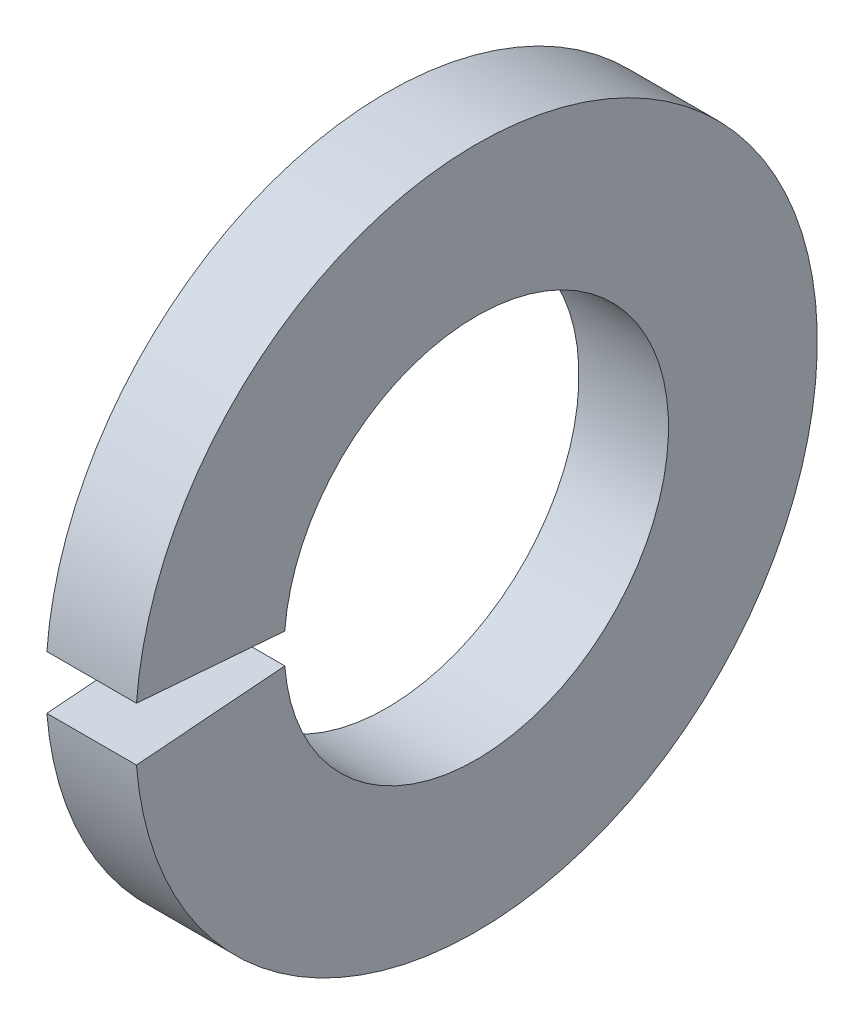
ISO-10303-21;
HEADER;
FILE_DESCRIPTION(('STEP AP214'),'2;1');
FILE_NAME('part.step','',(''),(''),'','','');
FILE_SCHEMA(('AUTOMOTIVE_DESIGN { 1 0 10303 214 1 1 1 1 }'));
ENDSEC;
DATA;
#1=APPLICATION_CONTEXT('core data for automotive mechanical design processes');
#2=APPLICATION_PROTOCOL_DEFINITION('international standard','automotive_design',2000,#1);
#3=PRODUCT_CONTEXT('',#1,'mechanical');
#4=PRODUCT('Part','Part','',(#3));
#5=PRODUCT_RELATED_PRODUCT_CATEGORY('part','',(#4));
#6=PRODUCT_DEFINITION_FORMATION('','',#4);
#7=PRODUCT_DEFINITION_CONTEXT('part definition',#1,'design');
#8=PRODUCT_DEFINITION('design','',#6,#7);
#9=PRODUCT_DEFINITION_SHAPE('','',#8);
#10=(LENGTH_UNIT() NAMED_UNIT(*) SI_UNIT(.MILLI.,.METRE.));
#11=(NAMED_UNIT(*) PLANE_ANGLE_UNIT() SI_UNIT($,.RADIAN.));
#12=(NAMED_UNIT(*) SI_UNIT($,.STERADIAN.) SOLID_ANGLE_UNIT());
#13=UNCERTAINTY_MEASURE_WITH_UNIT(LENGTH_MEASURE(1.E-05),#10,'distance_accuracy_value','');
#14=(GEOMETRIC_REPRESENTATION_CONTEXT(3) GLOBAL_UNCERTAINTY_ASSIGNED_CONTEXT((#13)) GLOBAL_UNIT_ASSIGNED_CONTEXT((#10,
#11,#12)) REPRESENTATION_CONTEXT('',''));
#15=CARTESIAN_POINT('',(0.,0.,0.));
#16=DIRECTION('',(0.,0.,1.));
#17=DIRECTION('',(1.,0.,0.));
#18=AXIS2_PLACEMENT_3D('',#15,#16,#17);
#19=CARTESIAN_POINT('',(-34.9249999999999,0.,0.));
#20=DIRECTION('',(-1.,0.,0.));
#21=DIRECTION('',(0.,0.,1.));
#22=AXIS2_PLACEMENT_3D('',#19,#20,#21);
#23=CYLINDRICAL_SURFACE('',#22,1.6891);
#24=CARTESIAN_POINT('',(0.,0.,0.));
#25=DIRECTION('',(-1.,0.,0.));
#26=DIRECTION('',(0.,0.,1.));
#27=AXIS2_PLACEMENT_3D('',#24,#25,#26);
#28=CIRCLE('',#27,1.6891);
#29=CARTESIAN_POINT('',(0.,0.132525258593904,1.68389306840863));
#30=VERTEX_POINT('',#29);
#31=CARTESIAN_POINT('',(0.,-0.132525258593904,1.68389306840863));
#32=VERTEX_POINT('',#31);
#33=EDGE_CURVE('E85',#30,#32,#28,.T.);
#34=ORIENTED_EDGE('',*,*,#33,.F.);
#35=DIRECTION('',(-1.,0.,0.));
#36=VECTOR('',#35,1.);
#37=CARTESIAN_POINT('',(-34.9249999999999,0.132525258593904,1.68389306840863));
#38=LINE('',#37,#36);
#39=CARTESIAN_POINT('',(-0.787400000000001,0.132525258593904,1.68389306840863));
#40=VERTEX_POINT('',#39);
#41=EDGE_CURVE('E99',#30,#40,#38,.T.);
#42=ORIENTED_EDGE('',*,*,#41,.T.);
#43=CARTESIAN_POINT('',(-0.787400000000001,0.,0.));
#44=DIRECTION('',(-1.,0.,0.));
#45=DIRECTION('',(0.,0.,1.));
#46=AXIS2_PLACEMENT_3D('',#43,#44,#45);
#47=CIRCLE('',#46,1.6891);
#48=CARTESIAN_POINT('',(-0.787400000000001,-0.132525258593903,1.68389306840863));
#49=VERTEX_POINT('',#48);
#50=EDGE_CURVE('E87',#40,#49,#47,.T.);
#51=ORIENTED_EDGE('',*,*,#50,.T.);
#52=DIRECTION('',(-1.,0.,0.));
#53=VECTOR('',#52,1.);
#54=CARTESIAN_POINT('',(-34.9249999999999,-0.132525258593904,1.68389306840863));
#55=LINE('',#54,#53);
#56=EDGE_CURVE('E55',#32,#49,#55,.T.);
#57=ORIENTED_EDGE('',*,*,#56,.F.);
#58=EDGE_LOOP('',(#34,#42,#51,#57));
#59=FACE_BOUND('',#58,.T.);
#60=ADVANCED_FACE('F34',(#59),#23,.F.);
#61=CARTESIAN_POINT('',(0.,1.6891,0.));
#62=DIRECTION('',(-1.,0.,0.));
#63=DIRECTION('',(0.,0.,1.));
#64=AXIS2_PLACEMENT_3D('',#61,#62,#63);
#65=PLANE('',#64);
#66=CARTESIAN_POINT('',(0.,0.,0.));
#67=DIRECTION('',(-1.,0.,0.));
#68=DIRECTION('',(0.,0.,1.));
#69=AXIS2_PLACEMENT_3D('',#66,#67,#68);
#70=CIRCLE('',#69,2.9972);
#71=CARTESIAN_POINT('',(0.,0.235157601715499,2.98796063266493));
#72=VERTEX_POINT('',#71);
#73=CARTESIAN_POINT('',(0.,-0.235157601715499,2.98796063266493));
#74=VERTEX_POINT('',#73);
#75=EDGE_CURVE('E91',#72,#74,#70,.T.);
#76=ORIENTED_EDGE('',*,*,#75,.F.);
#77=DIRECTION('',(0.,0.0784590957278456,0.996917333733128));
#78=VECTOR('',#77,1.);
#79=CARTESIAN_POINT('',(0.,0.,0.));
#80=LINE('',#79,#78);
#81=EDGE_CURVE('E79',#30,#72,#80,.T.);
#82=ORIENTED_EDGE('',*,*,#81,.F.);
#83=ORIENTED_EDGE('',*,*,#33,.T.);
#84=DIRECTION('',(0.,-0.0784590957278456,0.996917333733128));
#85=VECTOR('',#84,1.);
#86=CARTESIAN_POINT('',(0.,0.,0.));
#87=LINE('',#86,#85);
#88=EDGE_CURVE('E71',#32,#74,#87,.T.);
#89=ORIENTED_EDGE('',*,*,#88,.T.);
#90=EDGE_LOOP('',(#76,#82,#83,#89));
#91=FACE_BOUND('',#90,.T.);
#92=ADVANCED_FACE('F90',(#91),#65,.F.);
#93=CARTESIAN_POINT('',(-34.9249999999999,0.,0.));
#94=DIRECTION('',(-1.,0.,0.));
#95=DIRECTION('',(0.,0.,1.));
#96=AXIS2_PLACEMENT_3D('',#93,#94,#95);
#97=CYLINDRICAL_SURFACE('',#96,2.9972);
#98=CARTESIAN_POINT('',(-0.787400000000001,0.,0.));
#99=DIRECTION('',(-1.,0.,0.));
#100=DIRECTION('',(0.,0.,1.));
#101=AXIS2_PLACEMENT_3D('',#98,#99,#100);
#102=CIRCLE('',#101,2.9972);
#103=CARTESIAN_POINT('',(-0.787400000000001,0.235157601715499,2.98796063266493));
#104=VERTEX_POINT('',#103);
#105=CARTESIAN_POINT('',(-0.787400000000001,-0.235157601715499,2.98796063266493));
#106=VERTEX_POINT('',#105);
#107=EDGE_CURVE('E93',#104,#106,#102,.T.);
#108=ORIENTED_EDGE('',*,*,#107,.F.);
#109=DIRECTION('',(-1.,0.,0.));
#110=VECTOR('',#109,1.);
#111=CARTESIAN_POINT('',(-34.9249999999999,0.235157601715499,2.98796063266493));
#112=LINE('',#111,#110);
#113=EDGE_CURVE('E48',#104,#72,#112,.F.);
#114=ORIENTED_EDGE('',*,*,#113,.T.);
#115=ORIENTED_EDGE('',*,*,#75,.T.);
#116=DIRECTION('',(-1.,0.,0.));
#117=VECTOR('',#116,1.);
#118=CARTESIAN_POINT('',(-34.9249999999999,-0.235157601715499,2.98796063266493));
#119=LINE('',#118,#117);
#120=EDGE_CURVE('E74',#106,#74,#119,.F.);
#121=ORIENTED_EDGE('',*,*,#120,.F.);
#122=EDGE_LOOP('',(#108,#114,#115,#121));
#123=FACE_BOUND('',#122,.T.);
#124=ADVANCED_FACE('F106',(#123),#97,.T.);
#125=CARTESIAN_POINT('',(-0.7874,2.9972,0.));
#126=DIRECTION('',(1.,0.,0.));
#127=DIRECTION('',(0.,0.,-1.));
#128=AXIS2_PLACEMENT_3D('',#125,#126,#127);
#129=PLANE('',#128);
#130=ORIENTED_EDGE('',*,*,#50,.F.);
#131=DIRECTION('',(0.,0.0784590957278456,0.996917333733128));
#132=VECTOR('',#131,1.);
#133=CARTESIAN_POINT('',(-0.7874,0.0184502527841275,0.234432689309292));
#134=LINE('',#133,#132);
#135=EDGE_CURVE('E11',#40,#104,#134,.T.);
#136=ORIENTED_EDGE('',*,*,#135,.T.);
#137=ORIENTED_EDGE('',*,*,#107,.T.);
#138=DIRECTION('',(0.,-0.0784590957278456,0.996917333733128));
#139=VECTOR('',#138,1.);
#140=CARTESIAN_POINT('',(-0.7874,0.0184502527841275,-0.234432689309292));
#141=LINE('',#140,#139);
#142=EDGE_CURVE('E41',#49,#106,#141,.T.);
#143=ORIENTED_EDGE('',*,*,#142,.F.);
#144=EDGE_LOOP('',(#130,#136,#137,#143));
#145=FACE_BOUND('',#144,.T.);
#146=ADVANCED_FACE('F108',(#145),#129,.F.);
#147=CARTESIAN_POINT('',(-0.787400000000001,0.,0.));
#148=DIRECTION('',(0.,0.996917333733128,0.0784590957278456));
#149=DIRECTION('',(0.,-0.0784590957278456,0.996917333733128));
#150=AXIS2_PLACEMENT_3D('',#147,#148,#149);
#151=PLANE('',#150);
#152=ORIENTED_EDGE('',*,*,#56,.T.);
#153=ORIENTED_EDGE('',*,*,#142,.T.);
#154=ORIENTED_EDGE('',*,*,#120,.T.);
#155=ORIENTED_EDGE('',*,*,#88,.F.);
#156=EDGE_LOOP('',(#152,#153,#154,#155));
#157=FACE_BOUND('',#156,.T.);
#158=ADVANCED_FACE('F72',(#157),#151,.T.);
#159=CARTESIAN_POINT('',(-0.787400000000001,0.,0.));
#160=DIRECTION('',(0.,0.996917333733128,-0.0784590957278456));
#161=DIRECTION('',(0.,0.0784590957278456,0.996917333733128));
#162=AXIS2_PLACEMENT_3D('',#159,#160,#161);
#163=PLANE('',#162);
#164=ORIENTED_EDGE('',*,*,#81,.T.);
#165=ORIENTED_EDGE('',*,*,#113,.F.);
#166=ORIENTED_EDGE('',*,*,#135,.F.);
#167=ORIENTED_EDGE('',*,*,#41,.F.);
#168=EDGE_LOOP('',(#164,#165,#166,#167));
#169=FACE_BOUND('',#168,.T.);
#170=ADVANCED_FACE('F103',(#169),#163,.F.);
#171=CLOSED_SHELL('',(#60,#92,#124,#146,#158,#170));
#172=MANIFOLD_SOLID_BREP('B2',#171);
#173=ADVANCED_BREP_SHAPE_REPRESENTATION('',(#18,#172),#14);
#174=SHAPE_DEFINITION_REPRESENTATION(#9,#173);
ENDSEC;
END-ISO-10303-21;
